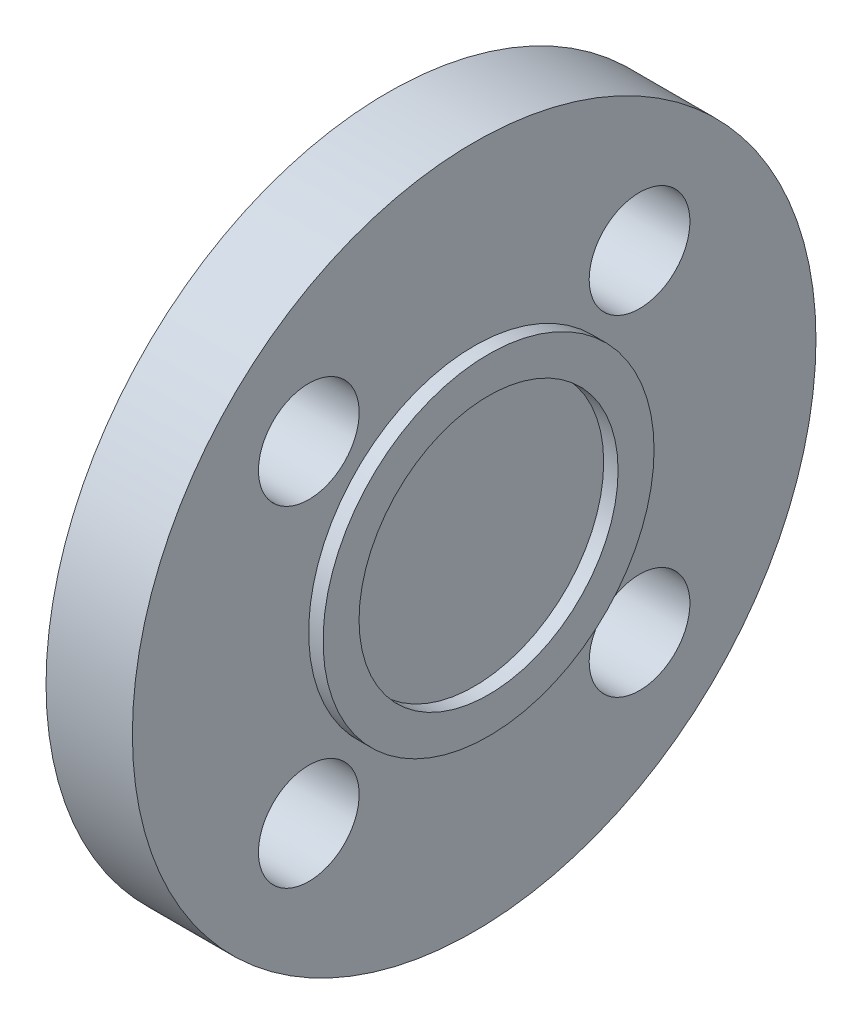
ISO-10303-21;
HEADER;
FILE_DESCRIPTION(('STEP AP214'),'2;1');
FILE_NAME('part.step','',(''),(''),'','','');
FILE_SCHEMA(('AUTOMOTIVE_DESIGN { 1 0 10303 214 1 1 1 1 }'));
ENDSEC;
DATA;
#1=APPLICATION_CONTEXT('core data for automotive mechanical design processes');
#2=APPLICATION_PROTOCOL_DEFINITION('international standard','automotive_design',2000,#1);
#3=PRODUCT_CONTEXT('',#1,'mechanical');
#4=PRODUCT('Part','Part','',(#3));
#5=PRODUCT_RELATED_PRODUCT_CATEGORY('part','',(#4));
#6=PRODUCT_DEFINITION_FORMATION('','',#4);
#7=PRODUCT_DEFINITION_CONTEXT('part definition',#1,'design');
#8=PRODUCT_DEFINITION('design','',#6,#7);
#9=PRODUCT_DEFINITION_SHAPE('','',#8);
#10=(LENGTH_UNIT() NAMED_UNIT(*) SI_UNIT(.MILLI.,.METRE.));
#11=(NAMED_UNIT(*) PLANE_ANGLE_UNIT() SI_UNIT($,.RADIAN.));
#12=(NAMED_UNIT(*) SI_UNIT($,.STERADIAN.) SOLID_ANGLE_UNIT());
#13=UNCERTAINTY_MEASURE_WITH_UNIT(LENGTH_MEASURE(1.E-05),#10,'distance_accuracy_value','');
#14=(GEOMETRIC_REPRESENTATION_CONTEXT(3) GLOBAL_UNCERTAINTY_ASSIGNED_CONTEXT((#13)) GLOBAL_UNIT_ASSIGNED_CONTEXT((#10,
#11,#12)) REPRESENTATION_CONTEXT('',''));
#15=CARTESIAN_POINT('',(0.,0.,0.));
#16=DIRECTION('',(0.,0.,1.));
#17=DIRECTION('',(1.,0.,0.));
#18=AXIS2_PLACEMENT_3D('',#15,#16,#17);
#19=CARTESIAN_POINT('',(12.,9.,0.));
#20=DIRECTION('',(1.,0.,0.));
#21=DIRECTION('',(0.,0.,-1.));
#22=AXIS2_PLACEMENT_3D('',#19,#20,#21);
#23=PLANE('',#22);
#24=CARTESIAN_POINT('',(12.,0.,0.));
#25=DIRECTION('',(1.,0.,0.));
#26=DIRECTION('',(0.,0.,-1.));
#27=AXIS2_PLACEMENT_3D('',#24,#25,#26);
#28=CIRCLE('',#27,18.);
#29=CARTESIAN_POINT('',(12.,0.,-18.));
#30=VERTEX_POINT('',#29);
#31=EDGE_CURVE('E18',#30,#30,#28,.T.);
#32=ORIENTED_EDGE('',*,*,#31,.T.);
#33=EDGE_LOOP('',(#32));
#34=FACE_BOUND('',#33,.T.);
#35=ADVANCED_FACE('F15',(#34),#23,.T.);
#36=CARTESIAN_POINT('',(13.,0.,0.));
#37=DIRECTION('',(1.,0.,0.));
#38=DIRECTION('',(0.,0.,-1.));
#39=AXIS2_PLACEMENT_3D('',#36,#37,#38);
#40=CYLINDRICAL_SURFACE('',#39,18.);
#41=CARTESIAN_POINT('',(14.,0.,0.));
#42=DIRECTION('',(1.,0.,0.));
#43=DIRECTION('',(0.,0.,-1.));
#44=AXIS2_PLACEMENT_3D('',#41,#42,#43);
#45=CIRCLE('',#44,18.);
#46=CARTESIAN_POINT('',(14.,0.,-18.));
#47=VERTEX_POINT('',#46);
#48=EDGE_CURVE('E58',#47,#47,#45,.F.);
#49=ORIENTED_EDGE('',*,*,#48,.F.);
#50=EDGE_LOOP('',(#49));
#51=FACE_BOUND('',#50,.T.);
#52=ORIENTED_EDGE('',*,*,#31,.F.);
#53=EDGE_LOOP('',(#52));
#54=FACE_BOUND('',#53,.T.);
#55=ADVANCED_FACE('F66',(#51,#54),#40,.F.);
#56=CARTESIAN_POINT('',(14.,20.5,0.));
#57=DIRECTION('',(1.,0.,0.));
#58=DIRECTION('',(0.,0.,-1.));
#59=AXIS2_PLACEMENT_3D('',#56,#57,#58);
#60=PLANE('',#59);
#61=ORIENTED_EDGE('',*,*,#48,.T.);
#62=EDGE_LOOP('',(#61));
#63=FACE_BOUND('',#62,.T.);
#64=CARTESIAN_POINT('',(14.,0.,0.));
#65=DIRECTION('',(1.,0.,0.));
#66=DIRECTION('',(0.,0.,-1.));
#67=AXIS2_PLACEMENT_3D('',#64,#65,#66);
#68=CIRCLE('',#67,23.);
#69=CARTESIAN_POINT('',(14.,0.,-23.));
#70=VERTEX_POINT('',#69);
#71=EDGE_CURVE('E56',#70,#70,#68,.F.);
#72=ORIENTED_EDGE('',*,*,#71,.F.);
#73=EDGE_LOOP('',(#72));
#74=FACE_BOUND('',#73,.T.);
#75=ADVANCED_FACE('F68',(#63,#74),#60,.T.);
#76=CARTESIAN_POINT('',(13.,0.,0.));
#77=DIRECTION('',(1.,0.,0.));
#78=DIRECTION('',(0.,0.,-1.));
#79=AXIS2_PLACEMENT_3D('',#76,#77,#78);
#80=CYLINDRICAL_SURFACE('',#79,23.);
#81=CARTESIAN_POINT('',(12.,0.,0.));
#82=DIRECTION('',(1.,0.,0.));
#83=DIRECTION('',(0.,0.,-1.));
#84=AXIS2_PLACEMENT_3D('',#81,#82,#83);
#85=CIRCLE('',#84,23.);
#86=CARTESIAN_POINT('',(12.,0.,-23.));
#87=VERTEX_POINT('',#86);
#88=EDGE_CURVE('E53',#87,#87,#85,.F.);
#89=ORIENTED_EDGE('',*,*,#88,.F.);
#90=EDGE_LOOP('',(#89));
#91=FACE_BOUND('',#90,.T.);
#92=ORIENTED_EDGE('',*,*,#71,.T.);
#93=EDGE_LOOP('',(#92));
#94=FACE_BOUND('',#93,.T.);
#95=ADVANCED_FACE('F75',(#91,#94),#80,.T.);
#96=CARTESIAN_POINT('',(12.,35.25,0.));
#97=DIRECTION('',(1.,0.,0.));
#98=DIRECTION('',(0.,0.,-1.));
#99=AXIS2_PLACEMENT_3D('',#96,#97,#98);
#100=PLANE('',#99);
#101=ORIENTED_EDGE('',*,*,#88,.T.);
#102=EDGE_LOOP('',(#101));
#103=FACE_BOUND('',#102,.T.);
#104=CARTESIAN_POINT('',(12.,22.9809703885628,22.9809703885628));
#105=DIRECTION('',(-1.,0.,0.));
#106=DIRECTION('',(0.,0.,1.));
#107=AXIS2_PLACEMENT_3D('',#104,#105,#106);
#108=CIRCLE('',#107,7.);
#109=CARTESIAN_POINT('',(12.,22.9809703885628,29.9809703885628));
#110=VERTEX_POINT('',#109);
#111=EDGE_CURVE('E38',#110,#110,#108,.T.);
#112=ORIENTED_EDGE('',*,*,#111,.T.);
#113=EDGE_LOOP('',(#112));
#114=FACE_BOUND('',#113,.T.);
#115=CARTESIAN_POINT('',(12.,-22.9809703885628,22.9809703885628));
#116=DIRECTION('',(-1.,0.,0.));
#117=DIRECTION('',(0.,0.,1.));
#118=AXIS2_PLACEMENT_3D('',#115,#116,#117);
#119=CIRCLE('',#118,7.);
#120=CARTESIAN_POINT('',(12.,-22.9809703885628,29.9809703885628));
#121=VERTEX_POINT('',#120);
#122=EDGE_CURVE('E41',#121,#121,#119,.T.);
#123=ORIENTED_EDGE('',*,*,#122,.T.);
#124=EDGE_LOOP('',(#123));
#125=FACE_BOUND('',#124,.T.);
#126=CARTESIAN_POINT('',(12.,-22.9809703885628,-22.9809703885628));
#127=DIRECTION('',(-1.,0.,0.));
#128=DIRECTION('',(0.,0.,1.));
#129=AXIS2_PLACEMENT_3D('',#126,#127,#128);
#130=CIRCLE('',#129,7.);
#131=CARTESIAN_POINT('',(12.,-22.9809703885628,-15.9809703885628));
#132=VERTEX_POINT('',#131);
#133=EDGE_CURVE('E44',#132,#132,#130,.T.);
#134=ORIENTED_EDGE('',*,*,#133,.T.);
#135=EDGE_LOOP('',(#134));
#136=FACE_BOUND('',#135,.T.);
#137=CARTESIAN_POINT('',(12.,22.9809703885628,-22.9809703885628));
#138=DIRECTION('',(-1.,0.,0.));
#139=DIRECTION('',(0.,0.,1.));
#140=AXIS2_PLACEMENT_3D('',#137,#138,#139);
#141=CIRCLE('',#140,7.);
#142=CARTESIAN_POINT('',(12.,22.9809703885628,-15.9809703885628));
#143=VERTEX_POINT('',#142);
#144=EDGE_CURVE('E47',#143,#143,#141,.T.);
#145=ORIENTED_EDGE('',*,*,#144,.T.);
#146=EDGE_LOOP('',(#145));
#147=FACE_BOUND('',#146,.T.);
#148=CARTESIAN_POINT('',(12.,0.,0.));
#149=DIRECTION('',(1.,0.,0.));
#150=DIRECTION('',(0.,0.,-1.));
#151=AXIS2_PLACEMENT_3D('',#148,#149,#150);
#152=CIRCLE('',#151,47.5);
#153=CARTESIAN_POINT('',(12.,0.,-47.5));
#154=VERTEX_POINT('',#153);
#155=EDGE_CURVE('E50',#154,#154,#152,.F.);
#156=ORIENTED_EDGE('',*,*,#155,.F.);
#157=EDGE_LOOP('',(#156));
#158=FACE_BOUND('',#157,.T.);
#159=ADVANCED_FACE('F103',(#103,#114,#125,#136,#147,#158),#100,.T.);
#160=CARTESIAN_POINT('',(5.99999999999999,0.,0.));
#161=DIRECTION('',(1.,0.,0.));
#162=DIRECTION('',(0.,0.,-1.));
#163=AXIS2_PLACEMENT_3D('',#160,#161,#162);
#164=CYLINDRICAL_SURFACE('',#163,47.5);
#165=CARTESIAN_POINT('',(0.,0.,0.));
#166=DIRECTION('',(1.,0.,0.));
#167=DIRECTION('',(0.,0.,-1.));
#168=AXIS2_PLACEMENT_3D('',#165,#166,#167);
#169=CIRCLE('',#168,47.5);
#170=CARTESIAN_POINT('',(0.,0.,-47.5));
#171=VERTEX_POINT('',#170);
#172=EDGE_CURVE('E35',#171,#171,#169,.F.);
#173=ORIENTED_EDGE('',*,*,#172,.F.);
#174=EDGE_LOOP('',(#173));
#175=FACE_BOUND('',#174,.T.);
#176=ORIENTED_EDGE('',*,*,#155,.T.);
#177=EDGE_LOOP('',(#176));
#178=FACE_BOUND('',#177,.T.);
#179=ADVANCED_FACE('F99',(#175,#178),#164,.T.);
#180=CARTESIAN_POINT('',(12.,22.9809703885628,-22.9809703885628));
#181=DIRECTION('',(-1.,0.,0.));
#182=DIRECTION('',(0.,0.,1.));
#183=AXIS2_PLACEMENT_3D('',#180,#181,#182);
#184=CYLINDRICAL_SURFACE('',#183,7.);
#185=ORIENTED_EDGE('',*,*,#144,.F.);
#186=EDGE_LOOP('',(#185));
#187=FACE_BOUND('',#186,.T.);
#188=CARTESIAN_POINT('',(0.,22.9809703885628,-22.9809703885628));
#189=DIRECTION('',(-1.,0.,0.));
#190=DIRECTION('',(0.,0.,1.));
#191=AXIS2_PLACEMENT_3D('',#188,#189,#190);
#192=CIRCLE('',#191,7.);
#193=CARTESIAN_POINT('',(0.,22.9809703885628,-15.9809703885628));
#194=VERTEX_POINT('',#193);
#195=EDGE_CURVE('E32',#194,#194,#192,.F.);
#196=ORIENTED_EDGE('',*,*,#195,.F.);
#197=EDGE_LOOP('',(#196));
#198=FACE_BOUND('',#197,.T.);
#199=ADVANCED_FACE('F95',(#187,#198),#184,.F.);
#200=CARTESIAN_POINT('',(12.,-22.9809703885628,-22.9809703885628));
#201=DIRECTION('',(-1.,0.,0.));
#202=DIRECTION('',(0.,0.,1.));
#203=AXIS2_PLACEMENT_3D('',#200,#201,#202);
#204=CYLINDRICAL_SURFACE('',#203,7.);
#205=ORIENTED_EDGE('',*,*,#133,.F.);
#206=EDGE_LOOP('',(#205));
#207=FACE_BOUND('',#206,.T.);
#208=CARTESIAN_POINT('',(0.,-22.9809703885628,-22.9809703885628));
#209=DIRECTION('',(-1.,0.,0.));
#210=DIRECTION('',(0.,0.,1.));
#211=AXIS2_PLACEMENT_3D('',#208,#209,#210);
#212=CIRCLE('',#211,7.);
#213=CARTESIAN_POINT('',(0.,-22.9809703885628,-15.9809703885628));
#214=VERTEX_POINT('',#213);
#215=EDGE_CURVE('E27',#214,#214,#212,.F.);
#216=ORIENTED_EDGE('',*,*,#215,.F.);
#217=EDGE_LOOP('',(#216));
#218=FACE_BOUND('',#217,.T.);
#219=ADVANCED_FACE('F91',(#207,#218),#204,.F.);
#220=CARTESIAN_POINT('',(12.,-22.9809703885628,22.9809703885628));
#221=DIRECTION('',(-1.,0.,0.));
#222=DIRECTION('',(0.,0.,1.));
#223=AXIS2_PLACEMENT_3D('',#220,#221,#222);
#224=CYLINDRICAL_SURFACE('',#223,7.);
#225=ORIENTED_EDGE('',*,*,#122,.F.);
#226=EDGE_LOOP('',(#225));
#227=FACE_BOUND('',#226,.T.);
#228=CARTESIAN_POINT('',(0.,-22.9809703885628,22.9809703885628));
#229=DIRECTION('',(-1.,0.,0.));
#230=DIRECTION('',(0.,0.,1.));
#231=AXIS2_PLACEMENT_3D('',#228,#229,#230);
#232=CIRCLE('',#231,7.);
#233=CARTESIAN_POINT('',(0.,-22.9809703885628,29.9809703885628));
#234=VERTEX_POINT('',#233);
#235=EDGE_CURVE('E22',#234,#234,#232,.F.);
#236=ORIENTED_EDGE('',*,*,#235,.F.);
#237=EDGE_LOOP('',(#236));
#238=FACE_BOUND('',#237,.T.);
#239=ADVANCED_FACE('F84',(#227,#238),#224,.F.);
#240=CARTESIAN_POINT('',(12.,22.9809703885628,22.9809703885628));
#241=DIRECTION('',(-1.,0.,0.));
#242=DIRECTION('',(0.,0.,1.));
#243=AXIS2_PLACEMENT_3D('',#240,#241,#242);
#244=CYLINDRICAL_SURFACE('',#243,7.);
#245=ORIENTED_EDGE('',*,*,#111,.F.);
#246=EDGE_LOOP('',(#245));
#247=FACE_BOUND('',#246,.T.);
#248=CARTESIAN_POINT('',(0.,22.9809703885628,22.9809703885628));
#249=DIRECTION('',(-1.,0.,0.));
#250=DIRECTION('',(0.,0.,1.));
#251=AXIS2_PLACEMENT_3D('',#248,#249,#250);
#252=CIRCLE('',#251,7.);
#253=CARTESIAN_POINT('',(0.,22.9809703885628,29.9809703885628));
#254=VERTEX_POINT('',#253);
#255=EDGE_CURVE('E10',#254,#254,#252,.F.);
#256=ORIENTED_EDGE('',*,*,#255,.F.);
#257=EDGE_LOOP('',(#256));
#258=FACE_BOUND('',#257,.T.);
#259=ADVANCED_FACE('F79',(#247,#258),#244,.F.);
#260=CARTESIAN_POINT('',(0.,23.75,0.));
#261=DIRECTION('',(-1.,0.,0.));
#262=DIRECTION('',(0.,0.,1.));
#263=AXIS2_PLACEMENT_3D('',#260,#261,#262);
#264=PLANE('',#263);
#265=ORIENTED_EDGE('',*,*,#255,.T.);
#266=EDGE_LOOP('',(#265));
#267=FACE_BOUND('',#266,.T.);
#268=ORIENTED_EDGE('',*,*,#235,.T.);
#269=EDGE_LOOP('',(#268));
#270=FACE_BOUND('',#269,.T.);
#271=ORIENTED_EDGE('',*,*,#215,.T.);
#272=EDGE_LOOP('',(#271));
#273=FACE_BOUND('',#272,.T.);
#274=ORIENTED_EDGE('',*,*,#195,.T.);
#275=EDGE_LOOP('',(#274));
#276=FACE_BOUND('',#275,.T.);
#277=ORIENTED_EDGE('',*,*,#172,.T.);
#278=EDGE_LOOP('',(#277));
#279=FACE_BOUND('',#278,.T.);
#280=ADVANCED_FACE('F77',(#267,#270,#273,#276,#279),#264,.T.);
#281=CLOSED_SHELL('',(#35,#55,#75,#95,#159,#179,#199,#219,#239,#259,#280));
#282=MANIFOLD_SOLID_BREP('B1',#281);
#283=ADVANCED_BREP_SHAPE_REPRESENTATION('',(#18,#282),#14);
#284=SHAPE_DEFINITION_REPRESENTATION(#9,#283);
ENDSEC;
END-ISO-10303-21;
